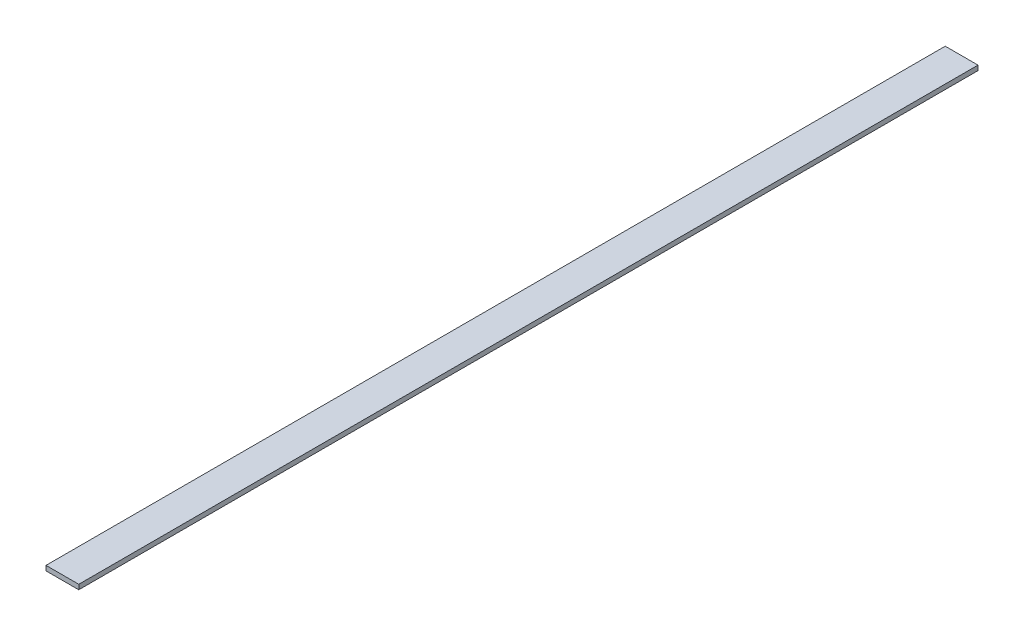
ISO-10303-21;
HEADER;
FILE_DESCRIPTION(('STEP AP214'),'2;1');
FILE_NAME('part.step','',(''),(''),'','','');
FILE_SCHEMA(('AUTOMOTIVE_DESIGN { 1 0 10303 214 1 1 1 1 }'));
ENDSEC;
DATA;
#1=APPLICATION_CONTEXT('core data for automotive mechanical design processes');
#2=APPLICATION_PROTOCOL_DEFINITION('international standard','automotive_design',2000,#1);
#3=PRODUCT_CONTEXT('',#1,'mechanical');
#4=PRODUCT('Part','Part','',(#3));
#5=PRODUCT_RELATED_PRODUCT_CATEGORY('part','',(#4));
#6=PRODUCT_DEFINITION_FORMATION('','',#4);
#7=PRODUCT_DEFINITION_CONTEXT('part definition',#1,'design');
#8=PRODUCT_DEFINITION('design','',#6,#7);
#9=PRODUCT_DEFINITION_SHAPE('','',#8);
#10=(LENGTH_UNIT() NAMED_UNIT(*) SI_UNIT(.MILLI.,.METRE.));
#11=(NAMED_UNIT(*) PLANE_ANGLE_UNIT() SI_UNIT($,.RADIAN.));
#12=(NAMED_UNIT(*) SI_UNIT($,.STERADIAN.) SOLID_ANGLE_UNIT());
#13=UNCERTAINTY_MEASURE_WITH_UNIT(LENGTH_MEASURE(1.E-05),#10,'distance_accuracy_value','');
#14=(GEOMETRIC_REPRESENTATION_CONTEXT(3) GLOBAL_UNCERTAINTY_ASSIGNED_CONTEXT((#13)) GLOBAL_UNIT_ASSIGNED_CONTEXT((#10,
#11,#12)) REPRESENTATION_CONTEXT('',''));
#15=CARTESIAN_POINT('',(0.,0.,0.));
#16=DIRECTION('',(0.,0.,1.));
#17=DIRECTION('',(1.,0.,0.));
#18=AXIS2_PLACEMENT_3D('',#15,#16,#17);
#19=CARTESIAN_POINT('',(-4.1,-0.600000000000001,225.));
#20=DIRECTION('',(1.,0.,0.));
#21=DIRECTION('',(0.,0.,-1.));
#22=AXIS2_PLACEMENT_3D('',#19,#20,#21);
#23=PLANE('',#22);
#24=DIRECTION('',(0.,-1.,0.));
#25=VECTOR('',#24,1.);
#26=CARTESIAN_POINT('',(-4.1,-0.600000000000001,0.));
#27=LINE('',#26,#25);
#28=CARTESIAN_POINT('',(-4.1,0.599999999999999,0.));
#29=VERTEX_POINT('',#28);
#30=CARTESIAN_POINT('',(-4.1,-0.600000000000001,0.));
#31=VERTEX_POINT('',#30);
#32=EDGE_CURVE('E95',#29,#31,#27,.T.);
#33=ORIENTED_EDGE('',*,*,#32,.T.);
#34=DIRECTION('',(0.,0.,-1.));
#35=VECTOR('',#34,1.);
#36=CARTESIAN_POINT('',(-4.1,-0.600000000000001,225.));
#37=LINE('',#36,#35);
#38=CARTESIAN_POINT('',(-4.1,-0.600000000000001,225.));
#39=VERTEX_POINT('',#38);
#40=EDGE_CURVE('E11',#39,#31,#37,.T.);
#41=ORIENTED_EDGE('',*,*,#40,.F.);
#42=DIRECTION('',(0.,-1.,0.));
#43=VECTOR('',#42,1.);
#44=CARTESIAN_POINT('',(-4.1,-0.600000000000001,225.));
#45=LINE('',#44,#43);
#46=CARTESIAN_POINT('',(-4.1,0.599999999999999,225.));
#47=VERTEX_POINT('',#46);
#48=EDGE_CURVE('E83',#47,#39,#45,.T.);
#49=ORIENTED_EDGE('',*,*,#48,.F.);
#50=DIRECTION('',(0.,0.,-1.));
#51=VECTOR('',#50,1.);
#52=CARTESIAN_POINT('',(-4.1,0.599999999999999,225.));
#53=LINE('',#52,#51);
#54=EDGE_CURVE('E91',#47,#29,#53,.T.);
#55=ORIENTED_EDGE('',*,*,#54,.T.);
#56=EDGE_LOOP('',(#33,#41,#49,#55));
#57=FACE_BOUND('',#56,.T.);
#58=ADVANCED_FACE('F32',(#57),#23,.F.);
#59=CARTESIAN_POINT('',(4.1,-0.599999999999999,225.));
#60=DIRECTION('',(0.,1.,0.));
#61=DIRECTION('',(-1.,0.,0.));
#62=AXIS2_PLACEMENT_3D('',#59,#60,#61);
#63=PLANE('',#62);
#64=DIRECTION('',(1.,0.,0.));
#65=VECTOR('',#64,1.);
#66=CARTESIAN_POINT('',(4.1,-0.599999999999999,0.));
#67=LINE('',#66,#65);
#68=CARTESIAN_POINT('',(4.1,-0.599999999999999,0.));
#69=VERTEX_POINT('',#68);
#70=EDGE_CURVE('E87',#31,#69,#67,.T.);
#71=ORIENTED_EDGE('',*,*,#70,.T.);
#72=DIRECTION('',(0.,0.,-1.));
#73=VECTOR('',#72,1.);
#74=CARTESIAN_POINT('',(4.1,-0.599999999999999,225.));
#75=LINE('',#74,#73);
#76=CARTESIAN_POINT('',(4.1,-0.599999999999999,225.));
#77=VERTEX_POINT('',#76);
#78=EDGE_CURVE('E40',#77,#69,#75,.T.);
#79=ORIENTED_EDGE('',*,*,#78,.F.);
#80=DIRECTION('',(1.,0.,0.));
#81=VECTOR('',#80,1.);
#82=CARTESIAN_POINT('',(4.1,-0.599999999999999,225.));
#83=LINE('',#82,#81);
#84=EDGE_CURVE('E78',#39,#77,#83,.T.);
#85=ORIENTED_EDGE('',*,*,#84,.F.);
#86=ORIENTED_EDGE('',*,*,#40,.T.);
#87=EDGE_LOOP('',(#71,#79,#85,#86));
#88=FACE_BOUND('',#87,.T.);
#89=ADVANCED_FACE('F86',(#88),#63,.F.);
#90=CARTESIAN_POINT('',(4.1,-0.599999999999999,225.));
#91=DIRECTION('',(-1.,0.,0.));
#92=DIRECTION('',(0.,0.,1.));
#93=AXIS2_PLACEMENT_3D('',#90,#91,#92);
#94=PLANE('',#93);
#95=DIRECTION('',(0.,1.,0.));
#96=VECTOR('',#95,1.);
#97=CARTESIAN_POINT('',(4.1,-0.599999999999999,0.));
#98=LINE('',#97,#96);
#99=CARTESIAN_POINT('',(4.1,0.6,0.));
#100=VERTEX_POINT('',#99);
#101=EDGE_CURVE('E65',#69,#100,#98,.T.);
#102=ORIENTED_EDGE('',*,*,#101,.T.);
#103=DIRECTION('',(0.,0.,-1.));
#104=VECTOR('',#103,1.);
#105=CARTESIAN_POINT('',(4.1,0.6,225.));
#106=LINE('',#105,#104);
#107=CARTESIAN_POINT('',(4.1,0.6,225.));
#108=VERTEX_POINT('',#107);
#109=EDGE_CURVE('E88',#108,#100,#106,.T.);
#110=ORIENTED_EDGE('',*,*,#109,.F.);
#111=DIRECTION('',(0.,1.,0.));
#112=VECTOR('',#111,1.);
#113=CARTESIAN_POINT('',(4.1,-0.599999999999999,225.));
#114=LINE('',#113,#112);
#115=EDGE_CURVE('E81',#77,#108,#114,.T.);
#116=ORIENTED_EDGE('',*,*,#115,.F.);
#117=ORIENTED_EDGE('',*,*,#78,.T.);
#118=EDGE_LOOP('',(#102,#110,#116,#117));
#119=FACE_BOUND('',#118,.T.);
#120=ADVANCED_FACE('F89',(#119),#94,.F.);
#121=CARTESIAN_POINT('',(4.1,0.6,225.));
#122=DIRECTION('',(0.,-1.,0.));
#123=DIRECTION('',(1.,0.,0.));
#124=AXIS2_PLACEMENT_3D('',#121,#122,#123);
#125=PLANE('',#124);
#126=DIRECTION('',(-1.,0.,0.));
#127=VECTOR('',#126,1.);
#128=CARTESIAN_POINT('',(4.1,0.6,0.));
#129=LINE('',#128,#127);
#130=EDGE_CURVE('E71',#100,#29,#129,.T.);
#131=ORIENTED_EDGE('',*,*,#130,.T.);
#132=ORIENTED_EDGE('',*,*,#54,.F.);
#133=DIRECTION('',(-1.,0.,0.));
#134=VECTOR('',#133,1.);
#135=CARTESIAN_POINT('',(4.1,0.6,225.));
#136=LINE('',#135,#134);
#137=EDGE_CURVE('E48',#108,#47,#136,.T.);
#138=ORIENTED_EDGE('',*,*,#137,.F.);
#139=ORIENTED_EDGE('',*,*,#109,.T.);
#140=EDGE_LOOP('',(#131,#132,#138,#139));
#141=FACE_BOUND('',#140,.T.);
#142=ADVANCED_FACE('F102',(#141),#125,.F.);
#143=CARTESIAN_POINT('',(0.,0.,225.));
#144=DIRECTION('',(0.,0.,1.));
#145=DIRECTION('',(1.,0.,0.));
#146=AXIS2_PLACEMENT_3D('',#143,#144,#145);
#147=PLANE('',#146);
#148=ORIENTED_EDGE('',*,*,#48,.T.);
#149=ORIENTED_EDGE('',*,*,#84,.T.);
#150=ORIENTED_EDGE('',*,*,#115,.T.);
#151=ORIENTED_EDGE('',*,*,#137,.T.);
#152=EDGE_LOOP('',(#148,#149,#150,#151));
#153=FACE_BOUND('',#152,.T.);
#154=ADVANCED_FACE('F79',(#153),#147,.T.);
#155=CARTESIAN_POINT('',(0.,0.,0.));
#156=DIRECTION('',(0.,0.,1.));
#157=DIRECTION('',(1.,0.,0.));
#158=AXIS2_PLACEMENT_3D('',#155,#156,#157);
#159=PLANE('',#158);
#160=ORIENTED_EDGE('',*,*,#32,.F.);
#161=ORIENTED_EDGE('',*,*,#130,.F.);
#162=ORIENTED_EDGE('',*,*,#101,.F.);
#163=ORIENTED_EDGE('',*,*,#70,.F.);
#164=EDGE_LOOP('',(#160,#161,#162,#163));
#165=FACE_BOUND('',#164,.T.);
#166=ADVANCED_FACE('F105',(#165),#159,.F.);
#167=CLOSED_SHELL('',(#58,#89,#120,#142,#154,#166));
#168=MANIFOLD_SOLID_BREP('B2',#167);
#169=ADVANCED_BREP_SHAPE_REPRESENTATION('',(#18,#168),#14);
#170=SHAPE_DEFINITION_REPRESENTATION(#9,#169);
ENDSEC;
END-ISO-10303-21;
